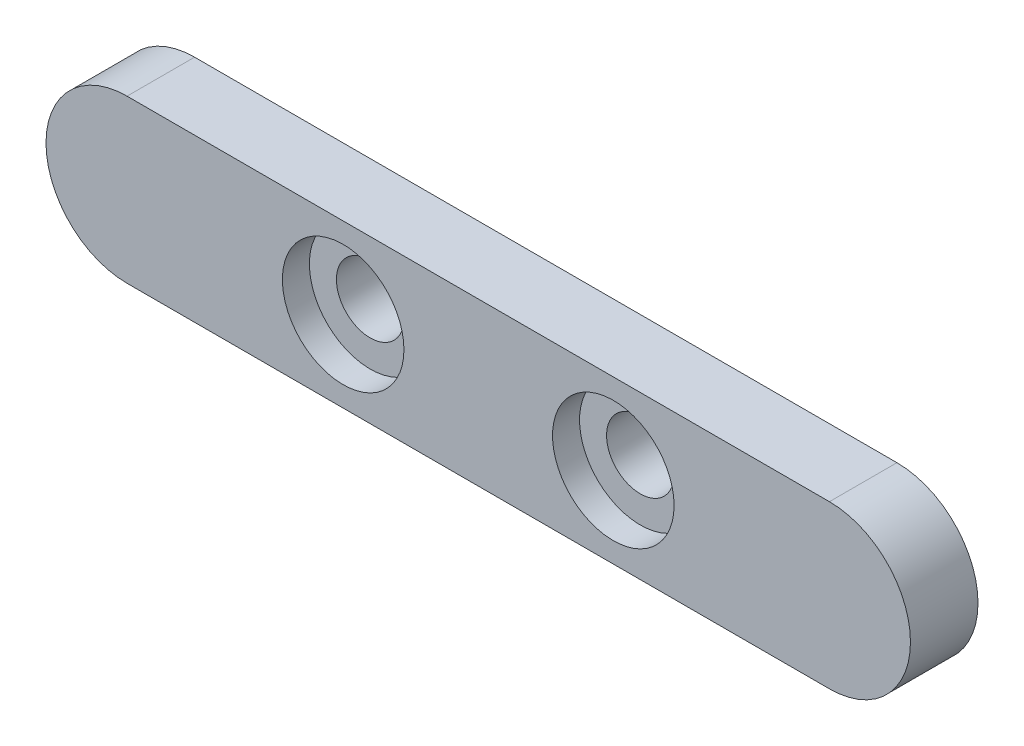
ISO-10303-21;
HEADER;
FILE_DESCRIPTION(('STEP AP214'),'2;1');
FILE_NAME('part.step','',(''),(''),'','','');
FILE_SCHEMA(('AUTOMOTIVE_DESIGN { 1 0 10303 214 1 1 1 1 }'));
ENDSEC;
DATA;
#1=APPLICATION_CONTEXT('core data for automotive mechanical design processes');
#2=APPLICATION_PROTOCOL_DEFINITION('international standard','automotive_design',2000,#1);
#3=PRODUCT_CONTEXT('',#1,'mechanical');
#4=PRODUCT('Part','Part','',(#3));
#5=PRODUCT_RELATED_PRODUCT_CATEGORY('part','',(#4));
#6=PRODUCT_DEFINITION_FORMATION('','',#4);
#7=PRODUCT_DEFINITION_CONTEXT('part definition',#1,'design');
#8=PRODUCT_DEFINITION('design','',#6,#7);
#9=PRODUCT_DEFINITION_SHAPE('','',#8);
#10=(LENGTH_UNIT() NAMED_UNIT(*) SI_UNIT(.MILLI.,.METRE.));
#11=(NAMED_UNIT(*) PLANE_ANGLE_UNIT() SI_UNIT($,.RADIAN.));
#12=(NAMED_UNIT(*) SI_UNIT($,.STERADIAN.) SOLID_ANGLE_UNIT());
#13=UNCERTAINTY_MEASURE_WITH_UNIT(LENGTH_MEASURE(1.E-05),#10,'distance_accuracy_value','');
#14=(GEOMETRIC_REPRESENTATION_CONTEXT(3) GLOBAL_UNCERTAINTY_ASSIGNED_CONTEXT((#13)) GLOBAL_UNIT_ASSIGNED_CONTEXT((#10,
#11,#12)) REPRESENTATION_CONTEXT('',''));
#15=CARTESIAN_POINT('',(0.,0.,0.));
#16=DIRECTION('',(0.,0.,1.));
#17=DIRECTION('',(1.,0.,0.));
#18=AXIS2_PLACEMENT_3D('',#15,#16,#17);
#19=CARTESIAN_POINT('',(3.,0.,1.5));
#20=DIRECTION('',(0.,0.,-1.));
#21=DIRECTION('',(-1.,0.,0.));
#22=AXIS2_PLACEMENT_3D('',#19,#20,#21);
#23=CYLINDRICAL_SURFACE('',#22,0.75);
#24=CARTESIAN_POINT('',(3.,0.,0.));
#25=DIRECTION('',(0.,0.,1.));
#26=DIRECTION('',(1.,0.,0.));
#27=AXIS2_PLACEMENT_3D('',#24,#25,#26);
#28=CIRCLE('',#27,0.75);
#29=CARTESIAN_POINT('',(3.75,0.,0.));
#30=VERTEX_POINT('',#29);
#31=EDGE_CURVE('E115',#30,#30,#28,.T.);
#32=ORIENTED_EDGE('',*,*,#31,.F.);
#33=EDGE_LOOP('',(#32));
#34=FACE_BOUND('',#33,.T.);
#35=CARTESIAN_POINT('',(3.,0.,0.9));
#36=DIRECTION('',(0.,0.,1.));
#37=DIRECTION('',(1.,0.,0.));
#38=AXIS2_PLACEMENT_3D('',#35,#36,#37);
#39=CIRCLE('',#38,0.75);
#40=CARTESIAN_POINT('',(3.75,0.,0.9));
#41=VERTEX_POINT('',#40);
#42=EDGE_CURVE('E49',#41,#41,#39,.T.);
#43=ORIENTED_EDGE('',*,*,#42,.T.);
#44=EDGE_LOOP('',(#43));
#45=FACE_BOUND('',#44,.T.);
#46=ADVANCED_FACE('F45',(#34,#45),#23,.F.);
#47=CARTESIAN_POINT('',(-3.,0.,1.5));
#48=DIRECTION('',(0.,0.,-1.));
#49=DIRECTION('',(-1.,0.,0.));
#50=AXIS2_PLACEMENT_3D('',#47,#48,#49);
#51=CYLINDRICAL_SURFACE('',#50,0.75);
#52=CARTESIAN_POINT('',(-3.,0.,0.));
#53=DIRECTION('',(0.,0.,1.));
#54=DIRECTION('',(1.,0.,0.));
#55=AXIS2_PLACEMENT_3D('',#52,#53,#54);
#56=CIRCLE('',#55,0.75);
#57=CARTESIAN_POINT('',(-2.25,0.,0.));
#58=VERTEX_POINT('',#57);
#59=EDGE_CURVE('E126',#58,#58,#56,.T.);
#60=ORIENTED_EDGE('',*,*,#59,.F.);
#61=EDGE_LOOP('',(#60));
#62=FACE_BOUND('',#61,.T.);
#63=CARTESIAN_POINT('',(-3.,0.,0.9));
#64=DIRECTION('',(0.,0.,1.));
#65=DIRECTION('',(1.,0.,0.));
#66=AXIS2_PLACEMENT_3D('',#63,#64,#65);
#67=CIRCLE('',#66,0.75);
#68=CARTESIAN_POINT('',(-2.25,0.,0.9));
#69=VERTEX_POINT('',#68);
#70=EDGE_CURVE('E120',#69,#69,#67,.T.);
#71=ORIENTED_EDGE('',*,*,#70,.T.);
#72=EDGE_LOOP('',(#71));
#73=FACE_BOUND('',#72,.T.);
#74=ADVANCED_FACE('F151',(#62,#73),#51,.F.);
#75=CARTESIAN_POINT('',(-7.8,0.,1.5));
#76=DIRECTION('',(0.,0.,1.));
#77=DIRECTION('',(1.,0.,0.));
#78=AXIS2_PLACEMENT_3D('',#75,#76,#77);
#79=PLANE('',#78);
#80=CARTESIAN_POINT('',(-3.,0.,1.5));
#81=DIRECTION('',(0.,0.,1.));
#82=DIRECTION('',(1.,0.,0.));
#83=AXIS2_PLACEMENT_3D('',#80,#81,#82);
#84=CIRCLE('',#83,1.35);
#85=CARTESIAN_POINT('',(-1.65,0.,1.5));
#86=VERTEX_POINT('',#85);
#87=EDGE_CURVE('E128',#86,#86,#84,.T.);
#88=ORIENTED_EDGE('',*,*,#87,.F.);
#89=EDGE_LOOP('',(#88));
#90=FACE_BOUND('',#89,.T.);
#91=CARTESIAN_POINT('',(3.,0.,1.5));
#92=DIRECTION('',(0.,0.,1.));
#93=DIRECTION('',(1.,0.,0.));
#94=AXIS2_PLACEMENT_3D('',#91,#92,#93);
#95=CIRCLE('',#94,1.35);
#96=CARTESIAN_POINT('',(4.35,0.,1.5));
#97=VERTEX_POINT('',#96);
#98=EDGE_CURVE('E138',#97,#97,#95,.T.);
#99=ORIENTED_EDGE('',*,*,#98,.F.);
#100=EDGE_LOOP('',(#99));
#101=FACE_BOUND('',#100,.T.);
#102=CARTESIAN_POINT('',(-7.8,0.,1.5));
#103=DIRECTION('',(0.,0.,1.));
#104=DIRECTION('',(1.,0.,0.));
#105=AXIS2_PLACEMENT_3D('',#102,#103,#104);
#106=CIRCLE('',#105,1.8);
#107=CARTESIAN_POINT('',(-7.8,1.8,1.5));
#108=VERTEX_POINT('',#107);
#109=CARTESIAN_POINT('',(-7.8,-1.8,1.5));
#110=VERTEX_POINT('',#109);
#111=EDGE_CURVE('E99',#108,#110,#106,.T.);
#112=ORIENTED_EDGE('',*,*,#111,.T.);
#113=DIRECTION('',(1.,0.,0.));
#114=VECTOR('',#113,1.);
#115=CARTESIAN_POINT('',(-7.8,-1.8,1.5));
#116=LINE('',#115,#114);
#117=CARTESIAN_POINT('',(7.8,-1.8,1.5));
#118=VERTEX_POINT('',#117);
#119=EDGE_CURVE('E94',#110,#118,#116,.T.);
#120=ORIENTED_EDGE('',*,*,#119,.T.);
#121=CARTESIAN_POINT('',(7.8,0.,1.5));
#122=DIRECTION('',(0.,0.,1.));
#123=DIRECTION('',(1.,0.,0.));
#124=AXIS2_PLACEMENT_3D('',#121,#122,#123);
#125=CIRCLE('',#124,1.8);
#126=CARTESIAN_POINT('',(7.8,1.80000000000001,1.5));
#127=VERTEX_POINT('',#126);
#128=EDGE_CURVE('E97',#118,#127,#125,.T.);
#129=ORIENTED_EDGE('',*,*,#128,.T.);
#130=DIRECTION('',(-1.,0.,0.));
#131=VECTOR('',#130,1.);
#132=CARTESIAN_POINT('',(-7.8,1.8,1.5));
#133=LINE('',#132,#131);
#134=EDGE_CURVE('E64',#127,#108,#133,.T.);
#135=ORIENTED_EDGE('',*,*,#134,.T.);
#136=EDGE_LOOP('',(#112,#120,#129,#135));
#137=FACE_BOUND('',#136,.T.);
#138=ADVANCED_FACE('F95',(#90,#101,#137),#79,.T.);
#139=CARTESIAN_POINT('',(-7.8,0.,0.));
#140=DIRECTION('',(0.,0.,1.));
#141=DIRECTION('',(1.,0.,0.));
#142=AXIS2_PLACEMENT_3D('',#139,#140,#141);
#143=PLANE('',#142);
#144=CARTESIAN_POINT('',(-7.8,0.,0.));
#145=DIRECTION('',(0.,0.,1.));
#146=DIRECTION('',(1.,0.,0.));
#147=AXIS2_PLACEMENT_3D('',#144,#145,#146);
#148=CIRCLE('',#147,1.8);
#149=CARTESIAN_POINT('',(-7.8,1.8,0.));
#150=VERTEX_POINT('',#149);
#151=CARTESIAN_POINT('',(-7.8,-1.8,0.));
#152=VERTEX_POINT('',#151);
#153=EDGE_CURVE('E112',#150,#152,#148,.T.);
#154=ORIENTED_EDGE('',*,*,#153,.F.);
#155=DIRECTION('',(-1.,0.,0.));
#156=VECTOR('',#155,1.);
#157=CARTESIAN_POINT('',(-7.8,1.8,0.));
#158=LINE('',#157,#156);
#159=CARTESIAN_POINT('',(7.8,1.80000000000001,0.));
#160=VERTEX_POINT('',#159);
#161=EDGE_CURVE('E87',#160,#150,#158,.T.);
#162=ORIENTED_EDGE('',*,*,#161,.F.);
#163=CARTESIAN_POINT('',(7.8,0.,0.));
#164=DIRECTION('',(0.,0.,1.));
#165=DIRECTION('',(1.,0.,0.));
#166=AXIS2_PLACEMENT_3D('',#163,#164,#165);
#167=CIRCLE('',#166,1.8);
#168=CARTESIAN_POINT('',(7.8,-1.8,0.));
#169=VERTEX_POINT('',#168);
#170=EDGE_CURVE('E81',#169,#160,#167,.T.);
#171=ORIENTED_EDGE('',*,*,#170,.F.);
#172=DIRECTION('',(1.,0.,0.));
#173=VECTOR('',#172,1.);
#174=CARTESIAN_POINT('',(-7.8,-1.8,0.));
#175=LINE('',#174,#173);
#176=EDGE_CURVE('E103',#152,#169,#175,.T.);
#177=ORIENTED_EDGE('',*,*,#176,.F.);
#178=EDGE_LOOP('',(#154,#162,#171,#177));
#179=FACE_BOUND('',#178,.T.);
#180=ORIENTED_EDGE('',*,*,#31,.T.);
#181=EDGE_LOOP('',(#180));
#182=FACE_BOUND('',#181,.T.);
#183=ORIENTED_EDGE('',*,*,#59,.T.);
#184=EDGE_LOOP('',(#183));
#185=FACE_BOUND('',#184,.T.);
#186=ADVANCED_FACE('F146',(#179,#182,#185),#143,.F.);
#187=CARTESIAN_POINT('',(-7.8,0.,1.5));
#188=DIRECTION('',(0.,0.,-1.));
#189=DIRECTION('',(-1.,0.,0.));
#190=AXIS2_PLACEMENT_3D('',#187,#188,#189);
#191=CYLINDRICAL_SURFACE('',#190,1.8);
#192=ORIENTED_EDGE('',*,*,#153,.T.);
#193=DIRECTION('',(0.,0.,-1.));
#194=VECTOR('',#193,1.);
#195=CARTESIAN_POINT('',(-7.8,-1.8,1.5));
#196=LINE('',#195,#194);
#197=EDGE_CURVE('E11',#110,#152,#196,.T.);
#198=ORIENTED_EDGE('',*,*,#197,.F.);
#199=ORIENTED_EDGE('',*,*,#111,.F.);
#200=DIRECTION('',(0.,0.,-1.));
#201=VECTOR('',#200,1.);
#202=CARTESIAN_POINT('',(-7.8,1.8,1.5));
#203=LINE('',#202,#201);
#204=EDGE_CURVE('E108',#108,#150,#203,.T.);
#205=ORIENTED_EDGE('',*,*,#204,.T.);
#206=EDGE_LOOP('',(#192,#198,#199,#205));
#207=FACE_BOUND('',#206,.T.);
#208=ADVANCED_FACE('F47',(#207),#191,.T.);
#209=CARTESIAN_POINT('',(-7.8,-1.8,1.5));
#210=DIRECTION('',(0.,1.,0.));
#211=DIRECTION('',(-1.,0.,0.));
#212=AXIS2_PLACEMENT_3D('',#209,#210,#211);
#213=PLANE('',#212);
#214=ORIENTED_EDGE('',*,*,#176,.T.);
#215=DIRECTION('',(0.,0.,-1.));
#216=VECTOR('',#215,1.);
#217=CARTESIAN_POINT('',(7.8,-1.8,1.5));
#218=LINE('',#217,#216);
#219=EDGE_CURVE('E55',#118,#169,#218,.T.);
#220=ORIENTED_EDGE('',*,*,#219,.F.);
#221=ORIENTED_EDGE('',*,*,#119,.F.);
#222=ORIENTED_EDGE('',*,*,#197,.T.);
#223=EDGE_LOOP('',(#214,#220,#221,#222));
#224=FACE_BOUND('',#223,.T.);
#225=ADVANCED_FACE('F102',(#224),#213,.F.);
#226=CARTESIAN_POINT('',(7.8,0.,1.5));
#227=DIRECTION('',(0.,0.,-1.));
#228=DIRECTION('',(-1.,0.,0.));
#229=AXIS2_PLACEMENT_3D('',#226,#227,#228);
#230=CYLINDRICAL_SURFACE('',#229,1.8);
#231=ORIENTED_EDGE('',*,*,#170,.T.);
#232=DIRECTION('',(0.,0.,-1.));
#233=VECTOR('',#232,1.);
#234=CARTESIAN_POINT('',(7.8,1.80000000000001,1.5));
#235=LINE('',#234,#233);
#236=EDGE_CURVE('E104',#127,#160,#235,.T.);
#237=ORIENTED_EDGE('',*,*,#236,.F.);
#238=ORIENTED_EDGE('',*,*,#128,.F.);
#239=ORIENTED_EDGE('',*,*,#219,.T.);
#240=EDGE_LOOP('',(#231,#237,#238,#239));
#241=FACE_BOUND('',#240,.T.);
#242=ADVANCED_FACE('F106',(#241),#230,.T.);
#243=CARTESIAN_POINT('',(-7.8,1.8,1.5));
#244=DIRECTION('',(0.,-1.,0.));
#245=DIRECTION('',(1.,0.,0.));
#246=AXIS2_PLACEMENT_3D('',#243,#244,#245);
#247=PLANE('',#246);
#248=ORIENTED_EDGE('',*,*,#161,.T.);
#249=ORIENTED_EDGE('',*,*,#204,.F.);
#250=ORIENTED_EDGE('',*,*,#134,.F.);
#251=ORIENTED_EDGE('',*,*,#236,.T.);
#252=EDGE_LOOP('',(#248,#249,#250,#251));
#253=FACE_BOUND('',#252,.T.);
#254=ADVANCED_FACE('F181',(#253),#247,.F.);
#255=CARTESIAN_POINT('',(-3.,0.,0.9));
#256=DIRECTION('',(0.,0.,1.));
#257=DIRECTION('',(1.,0.,0.));
#258=AXIS2_PLACEMENT_3D('',#255,#256,#257);
#259=CYLINDRICAL_SURFACE('',#258,1.35);
#260=CARTESIAN_POINT('',(-3.,0.,0.9));
#261=DIRECTION('',(0.,0.,1.));
#262=DIRECTION('',(1.,0.,0.));
#263=AXIS2_PLACEMENT_3D('',#260,#261,#262);
#264=CIRCLE('',#263,1.35);
#265=CARTESIAN_POINT('',(-1.65,0.,0.9));
#266=VERTEX_POINT('',#265);
#267=EDGE_CURVE('E122',#266,#266,#264,.T.);
#268=ORIENTED_EDGE('',*,*,#267,.F.);
#269=EDGE_LOOP('',(#268));
#270=FACE_BOUND('',#269,.T.);
#271=ORIENTED_EDGE('',*,*,#87,.T.);
#272=EDGE_LOOP('',(#271));
#273=FACE_BOUND('',#272,.T.);
#274=ADVANCED_FACE('F184',(#270,#273),#259,.F.);
#275=CARTESIAN_POINT('',(-3.,0.,0.9));
#276=DIRECTION('',(0.,0.,1.));
#277=DIRECTION('',(1.,0.,0.));
#278=AXIS2_PLACEMENT_3D('',#275,#276,#277);
#279=PLANE('',#278);
#280=ORIENTED_EDGE('',*,*,#70,.F.);
#281=EDGE_LOOP('',(#280));
#282=FACE_BOUND('',#281,.T.);
#283=ORIENTED_EDGE('',*,*,#267,.T.);
#284=EDGE_LOOP('',(#283));
#285=FACE_BOUND('',#284,.T.);
#286=ADVANCED_FACE('F164',(#282,#285),#279,.T.);
#287=CARTESIAN_POINT('',(3.,0.,0.9));
#288=DIRECTION('',(0.,0.,1.));
#289=DIRECTION('',(1.,0.,0.));
#290=AXIS2_PLACEMENT_3D('',#287,#288,#289);
#291=CYLINDRICAL_SURFACE('',#290,1.35);
#292=CARTESIAN_POINT('',(3.,0.,0.9));
#293=DIRECTION('',(0.,0.,1.));
#294=DIRECTION('',(1.,0.,0.));
#295=AXIS2_PLACEMENT_3D('',#292,#293,#294);
#296=CIRCLE('',#295,1.35);
#297=CARTESIAN_POINT('',(4.35,0.,0.9));
#298=VERTEX_POINT('',#297);
#299=EDGE_CURVE('E133',#298,#298,#296,.T.);
#300=ORIENTED_EDGE('',*,*,#299,.F.);
#301=EDGE_LOOP('',(#300));
#302=FACE_BOUND('',#301,.T.);
#303=ORIENTED_EDGE('',*,*,#98,.T.);
#304=EDGE_LOOP('',(#303));
#305=FACE_BOUND('',#304,.T.);
#306=ADVANCED_FACE('F158',(#302,#305),#291,.F.);
#307=CARTESIAN_POINT('',(3.,0.,0.9));
#308=DIRECTION('',(0.,0.,1.));
#309=DIRECTION('',(1.,0.,0.));
#310=AXIS2_PLACEMENT_3D('',#307,#308,#309);
#311=PLANE('',#310);
#312=ORIENTED_EDGE('',*,*,#42,.F.);
#313=EDGE_LOOP('',(#312));
#314=FACE_BOUND('',#313,.T.);
#315=ORIENTED_EDGE('',*,*,#299,.T.);
#316=EDGE_LOOP('',(#315));
#317=FACE_BOUND('',#316,.T.);
#318=ADVANCED_FACE('F155',(#314,#317),#311,.T.);
#319=CLOSED_SHELL('',(#46,#74,#138,#186,#208,#225,#242,#254,#274,#286,#306,#318));
#320=MANIFOLD_SOLID_BREP('B2',#319);
#321=ADVANCED_BREP_SHAPE_REPRESENTATION('',(#18,#320),#14);
#322=SHAPE_DEFINITION_REPRESENTATION(#9,#321);
ENDSEC;
END-ISO-10303-21;
